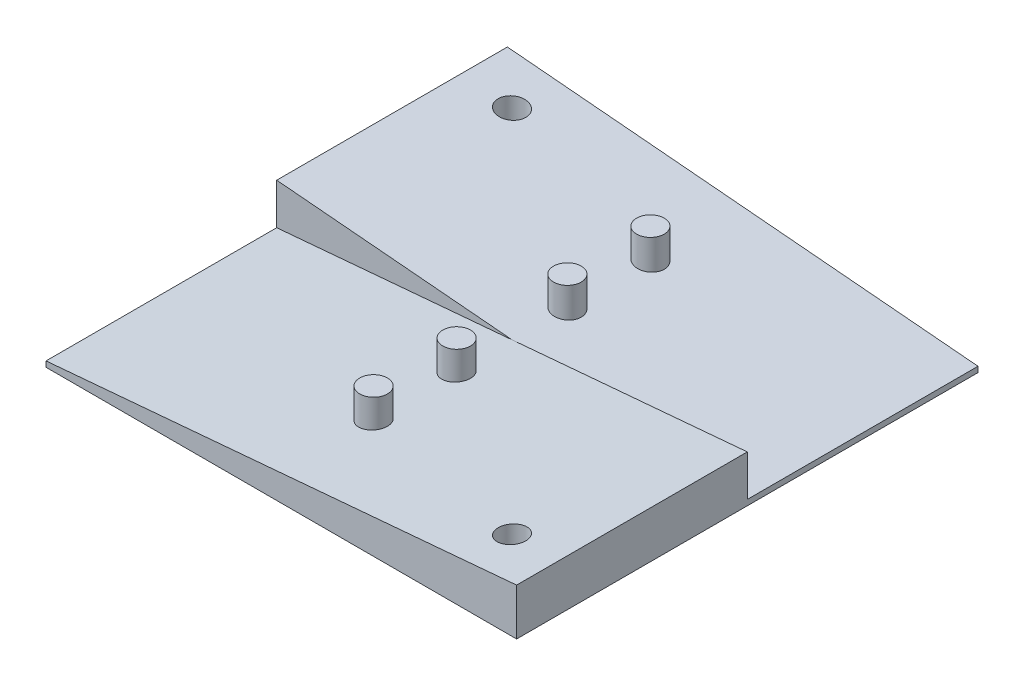
ISO-10303-21;
HEADER;
FILE_DESCRIPTION(('STEP AP214'),'2;1');
FILE_NAME('part.step','',(''),(''),'','','');
FILE_SCHEMA(('AUTOMOTIVE_DESIGN { 1 0 10303 214 1 1 1 1 }'));
ENDSEC;
DATA;
#1=APPLICATION_CONTEXT('core data for automotive mechanical design processes');
#2=APPLICATION_PROTOCOL_DEFINITION('international standard','automotive_design',2000,#1);
#3=PRODUCT_CONTEXT('',#1,'mechanical');
#4=PRODUCT('Part','Part','',(#3));
#5=PRODUCT_RELATED_PRODUCT_CATEGORY('part','',(#4));
#6=PRODUCT_DEFINITION_FORMATION('','',#4);
#7=PRODUCT_DEFINITION_CONTEXT('part definition',#1,'design');
#8=PRODUCT_DEFINITION('design','',#6,#7);
#9=PRODUCT_DEFINITION_SHAPE('','',#8);
#10=(LENGTH_UNIT() NAMED_UNIT(*) SI_UNIT(.MILLI.,.METRE.));
#11=(NAMED_UNIT(*) PLANE_ANGLE_UNIT() SI_UNIT($,.RADIAN.));
#12=(NAMED_UNIT(*) SI_UNIT($,.STERADIAN.) SOLID_ANGLE_UNIT());
#13=UNCERTAINTY_MEASURE_WITH_UNIT(LENGTH_MEASURE(1.E-05),#10,'distance_accuracy_value','');
#14=(GEOMETRIC_REPRESENTATION_CONTEXT(3) GLOBAL_UNCERTAINTY_ASSIGNED_CONTEXT((#13)) GLOBAL_UNIT_ASSIGNED_CONTEXT((#10,
#11,#12)) REPRESENTATION_CONTEXT('',''));
#15=CARTESIAN_POINT('',(0.,0.,0.));
#16=DIRECTION('',(0.,0.,1.));
#17=DIRECTION('',(1.,0.,0.));
#18=AXIS2_PLACEMENT_3D('',#15,#16,#17);
#19=CARTESIAN_POINT('',(-25.5,6.,-25.));
#20=DIRECTION('',(1.,0.,0.));
#21=DIRECTION('',(0.,0.,-1.));
#22=AXIS2_PLACEMENT_3D('',#19,#20,#21);
#23=PLANE('',#22);
#24=DIRECTION('',(0.,-1.,0.));
#25=VECTOR('',#24,1.);
#26=CARTESIAN_POINT('',(-25.5,0.6,0.));
#27=LINE('',#26,#25);
#28=CARTESIAN_POINT('',(-25.5,5.06192183982213,0.));
#29=VERTEX_POINT('',#28);
#30=CARTESIAN_POINT('',(-25.5,0.6,0.));
#31=VERTEX_POINT('',#30);
#32=EDGE_CURVE('E125',#29,#31,#27,.T.);
#33=ORIENTED_EDGE('',*,*,#32,.F.);
#34=DIRECTION('',(0.,0.,-1.));
#35=VECTOR('',#34,1.);
#36=CARTESIAN_POINT('',(-25.5,5.06192183982213,0.));
#37=LINE('',#36,#35);
#38=CARTESIAN_POINT('',(-25.5,5.06192183982213,-25.));
#39=VERTEX_POINT('',#38);
#40=EDGE_CURVE('E57',#29,#39,#37,.T.);
#41=ORIENTED_EDGE('',*,*,#40,.T.);
#42=DIRECTION('',(0.,-1.,0.));
#43=VECTOR('',#42,1.);
#44=CARTESIAN_POINT('',(-25.5,6.,-25.));
#45=LINE('',#44,#43);
#46=CARTESIAN_POINT('',(-25.5,0.,-25.));
#47=VERTEX_POINT('',#46);
#48=EDGE_CURVE('E64',#39,#47,#45,.T.);
#49=ORIENTED_EDGE('',*,*,#48,.T.);
#50=DIRECTION('',(0.,0.,1.));
#51=VECTOR('',#50,1.);
#52=CARTESIAN_POINT('',(-25.5,0.,-25.));
#53=LINE('',#52,#51);
#54=CARTESIAN_POINT('',(-25.5,0.,25.));
#55=VERTEX_POINT('',#54);
#56=EDGE_CURVE('E134',#47,#55,#53,.T.);
#57=ORIENTED_EDGE('',*,*,#56,.T.);
#58=DIRECTION('',(0.,-1.,0.));
#59=VECTOR('',#58,1.);
#60=CARTESIAN_POINT('',(-25.5,6.,25.));
#61=LINE('',#60,#59);
#62=CARTESIAN_POINT('',(-25.5,0.6,25.));
#63=VERTEX_POINT('',#62);
#64=EDGE_CURVE('E148',#63,#55,#61,.T.);
#65=ORIENTED_EDGE('',*,*,#64,.F.);
#66=DIRECTION('',(0.,0.,1.));
#67=VECTOR('',#66,1.);
#68=CARTESIAN_POINT('',(-25.5,0.6,0.));
#69=LINE('',#68,#67);
#70=EDGE_CURVE('E130',#31,#63,#69,.T.);
#71=ORIENTED_EDGE('',*,*,#70,.F.);
#72=EDGE_LOOP('',(#33,#41,#49,#57,#65,#71));
#73=FACE_BOUND('',#72,.T.);
#74=ADVANCED_FACE('F41',(#73),#23,.F.);
#75=CARTESIAN_POINT('',(25.5,6.,25.));
#76=DIRECTION('',(0.,0.,-1.));
#77=DIRECTION('',(-1.,0.,0.));
#78=AXIS2_PLACEMENT_3D('',#75,#76,#77);
#79=PLANE('',#78);
#80=DIRECTION('',(0.,-1.,0.));
#81=VECTOR('',#80,1.);
#82=CARTESIAN_POINT('',(25.5,6.,25.));
#83=LINE('',#82,#81);
#84=CARTESIAN_POINT('',(25.5,5.06192183982213,25.));
#85=VERTEX_POINT('',#84);
#86=CARTESIAN_POINT('',(25.5,0.,25.));
#87=VERTEX_POINT('',#86);
#88=EDGE_CURVE('E146',#85,#87,#83,.T.);
#89=ORIENTED_EDGE('',*,*,#88,.F.);
#90=DIRECTION('',(0.996194698091746,0.0871557427476583,0.));
#91=VECTOR('',#90,1.);
#92=CARTESIAN_POINT('',(-25.5,0.6,25.));
#93=LINE('',#92,#91);
#94=EDGE_CURVE('E121',#63,#85,#93,.T.);
#95=ORIENTED_EDGE('',*,*,#94,.F.);
#96=ORIENTED_EDGE('',*,*,#64,.T.);
#97=DIRECTION('',(1.,0.,0.));
#98=VECTOR('',#97,1.);
#99=CARTESIAN_POINT('',(25.5,0.,25.));
#100=LINE('',#99,#98);
#101=EDGE_CURVE('E137',#55,#87,#100,.T.);
#102=ORIENTED_EDGE('',*,*,#101,.T.);
#103=EDGE_LOOP('',(#89,#95,#96,#102));
#104=FACE_BOUND('',#103,.T.);
#105=ADVANCED_FACE('F224',(#104),#79,.F.);
#106=CARTESIAN_POINT('',(25.5,6.,-25.));
#107=DIRECTION('',(-1.,0.,0.));
#108=DIRECTION('',(0.,0.,1.));
#109=AXIS2_PLACEMENT_3D('',#106,#107,#108);
#110=PLANE('',#109);
#111=DIRECTION('',(0.,-1.,0.));
#112=VECTOR('',#111,1.);
#113=CARTESIAN_POINT('',(25.5,6.,-25.));
#114=LINE('',#113,#112);
#115=CARTESIAN_POINT('',(25.5,0.6,-25.));
#116=VERTEX_POINT('',#115);
#117=CARTESIAN_POINT('',(25.5,0.,-25.));
#118=VERTEX_POINT('',#117);
#119=EDGE_CURVE('E119',#116,#118,#114,.T.);
#120=ORIENTED_EDGE('',*,*,#119,.F.);
#121=DIRECTION('',(0.,0.,-1.));
#122=VECTOR('',#121,1.);
#123=CARTESIAN_POINT('',(25.5,0.6,0.));
#124=LINE('',#123,#122);
#125=CARTESIAN_POINT('',(25.5,0.6,0.));
#126=VERTEX_POINT('',#125);
#127=EDGE_CURVE('E112',#126,#116,#124,.T.);
#128=ORIENTED_EDGE('',*,*,#127,.F.);
#129=DIRECTION('',(0.,-1.,0.));
#130=VECTOR('',#129,1.);
#131=CARTESIAN_POINT('',(25.5,0.6,0.));
#132=LINE('',#131,#130);
#133=CARTESIAN_POINT('',(25.5,5.06192183982213,0.));
#134=VERTEX_POINT('',#133);
#135=EDGE_CURVE('E99',#134,#126,#132,.T.);
#136=ORIENTED_EDGE('',*,*,#135,.F.);
#137=DIRECTION('',(0.,0.,1.));
#138=VECTOR('',#137,1.);
#139=CARTESIAN_POINT('',(25.5,5.06192183982213,0.));
#140=LINE('',#139,#138);
#141=EDGE_CURVE('E132',#134,#85,#140,.T.);
#142=ORIENTED_EDGE('',*,*,#141,.T.);
#143=ORIENTED_EDGE('',*,*,#88,.T.);
#144=DIRECTION('',(0.,0.,-1.));
#145=VECTOR('',#144,1.);
#146=CARTESIAN_POINT('',(25.5,0.,-25.));
#147=LINE('',#146,#145);
#148=EDGE_CURVE('E140',#87,#118,#147,.T.);
#149=ORIENTED_EDGE('',*,*,#148,.T.);
#150=EDGE_LOOP('',(#120,#128,#136,#142,#143,#149));
#151=FACE_BOUND('',#150,.T.);
#152=ADVANCED_FACE('F117',(#151),#110,.F.);
#153=CARTESIAN_POINT('',(25.5,6.,-25.));
#154=DIRECTION('',(0.,0.,1.));
#155=DIRECTION('',(1.,0.,0.));
#156=AXIS2_PLACEMENT_3D('',#153,#154,#155);
#157=PLANE('',#156);
#158=ORIENTED_EDGE('',*,*,#48,.F.);
#159=DIRECTION('',(-0.996194698091746,0.0871557427476583,0.));
#160=VECTOR('',#159,1.);
#161=CARTESIAN_POINT('',(25.5,0.6,-25.));
#162=LINE('',#161,#160);
#163=EDGE_CURVE('E109',#116,#39,#162,.T.);
#164=ORIENTED_EDGE('',*,*,#163,.F.);
#165=ORIENTED_EDGE('',*,*,#119,.T.);
#166=DIRECTION('',(-1.,0.,0.));
#167=VECTOR('',#166,1.);
#168=CARTESIAN_POINT('',(25.5,0.,-25.));
#169=LINE('',#168,#167);
#170=EDGE_CURVE('E142',#118,#47,#169,.T.);
#171=ORIENTED_EDGE('',*,*,#170,.T.);
#172=EDGE_LOOP('',(#158,#164,#165,#171));
#173=FACE_BOUND('',#172,.T.);
#174=ADVANCED_FACE('F240',(#173),#157,.F.);
#175=CARTESIAN_POINT('',(0.,0.,0.));
#176=DIRECTION('',(0.,-1.,0.));
#177=DIRECTION('',(0.,0.,-1.));
#178=AXIS2_PLACEMENT_3D('',#175,#176,#177);
#179=PLANE('',#178);
#180=CARTESIAN_POINT('',(-20.,0.,-20.));
#181=DIRECTION('',(0.,-1.,0.));
#182=DIRECTION('',(0.,0.,-1.));
#183=AXIS2_PLACEMENT_3D('',#180,#181,#182);
#184=CIRCLE('',#183,3.00000000000002);
#185=CARTESIAN_POINT('',(-20.,0.,-23.));
#186=VERTEX_POINT('',#185);
#187=EDGE_CURVE('E50',#186,#186,#184,.F.);
#188=ORIENTED_EDGE('',*,*,#187,.T.);
#189=EDGE_LOOP('',(#188));
#190=FACE_BOUND('',#189,.T.);
#191=CARTESIAN_POINT('',(20.,0.,20.));
#192=DIRECTION('',(0.,-1.,0.));
#193=DIRECTION('',(0.,0.,-1.));
#194=AXIS2_PLACEMENT_3D('',#191,#192,#193);
#195=CIRCLE('',#194,3.00000000000002);
#196=CARTESIAN_POINT('',(20.,0.,17.));
#197=VERTEX_POINT('',#196);
#198=EDGE_CURVE('E176',#197,#197,#195,.F.);
#199=ORIENTED_EDGE('',*,*,#198,.T.);
#200=EDGE_LOOP('',(#199));
#201=FACE_BOUND('',#200,.T.);
#202=ORIENTED_EDGE('',*,*,#56,.F.);
#203=ORIENTED_EDGE('',*,*,#170,.F.);
#204=ORIENTED_EDGE('',*,*,#148,.F.);
#205=ORIENTED_EDGE('',*,*,#101,.F.);
#206=EDGE_LOOP('',(#202,#203,#204,#205));
#207=FACE_BOUND('',#206,.T.);
#208=ADVANCED_FACE('F181',(#190,#201,#207),#179,.T.);
#209=CARTESIAN_POINT('',(-25.5,0.6,0.));
#210=DIRECTION('',(0.0871557427476583,-0.996194698091746,0.));
#211=DIRECTION('',(0.996194698091746,0.0871557427476583,0.));
#212=AXIS2_PLACEMENT_3D('',#209,#210,#211);
#213=PLANE('',#212);
#214=CARTESIAN_POINT('',(20.,4.58073419042955,20.));
#215=DIRECTION('',(0.0871557427476583,-0.996194698091746,0.));
#216=DIRECTION('',(-0.996194698091746,-0.0871557427476583,0.));
#217=AXIS2_PLACEMENT_3D('',#214,#215,#216);
#218=ELLIPSE('',#217,1.50572975631502,1.5);
#219=CARTESIAN_POINT('',(18.5,4.44950119514066,20.));
#220=VERTEX_POINT('',#219);
#221=EDGE_CURVE('E171',#220,#220,#218,.T.);
#222=ORIENTED_EDGE('',*,*,#221,.T.);
#223=EDGE_LOOP('',(#222));
#224=FACE_BOUND('',#223,.T.);
#225=CARTESIAN_POINT('',(0.,2.83096091991106,15.));
#226=DIRECTION('',(0.0871557427476583,-0.996194698091746,0.));
#227=DIRECTION('',(-0.996194698091746,-0.0871557427476583,0.));
#228=AXIS2_PLACEMENT_3D('',#225,#226,#227);
#229=ELLIPSE('',#228,1.50572975631502,1.5);
#230=CARTESIAN_POINT('',(-1.5,2.69972792462218,15.));
#231=VERTEX_POINT('',#230);
#232=EDGE_CURVE('E156',#231,#231,#229,.T.);
#233=ORIENTED_EDGE('',*,*,#232,.T.);
#234=EDGE_LOOP('',(#233));
#235=FACE_BOUND('',#234,.T.);
#236=CARTESIAN_POINT('',(0.,2.83096091991106,6.));
#237=DIRECTION('',(0.0871557427476583,-0.996194698091746,0.));
#238=DIRECTION('',(-0.996194698091746,-0.0871557427476583,0.));
#239=AXIS2_PLACEMENT_3D('',#236,#237,#238);
#240=ELLIPSE('',#239,1.50572975631502,1.5);
#241=CARTESIAN_POINT('',(-1.5,2.69972792462218,6.));
#242=VERTEX_POINT('',#241);
#243=EDGE_CURVE('E152',#242,#242,#240,.T.);
#244=ORIENTED_EDGE('',*,*,#243,.T.);
#245=EDGE_LOOP('',(#244));
#246=FACE_BOUND('',#245,.T.);
#247=ORIENTED_EDGE('',*,*,#94,.T.);
#248=ORIENTED_EDGE('',*,*,#141,.F.);
#249=DIRECTION('',(0.996194698091746,0.0871557427476583,0.));
#250=VECTOR('',#249,1.);
#251=CARTESIAN_POINT('',(-25.5,0.6,0.));
#252=LINE('',#251,#250);
#253=CARTESIAN_POINT('',(-3.01841884819964E-13,2.83096091991109,0.));
#254=VERTEX_POINT('',#253);
#255=EDGE_CURVE('E104',#254,#134,#252,.T.);
#256=ORIENTED_EDGE('',*,*,#255,.F.);
#257=EDGE_CURVE('E127',#31,#254,#252,.T.);
#258=ORIENTED_EDGE('',*,*,#257,.F.);
#259=ORIENTED_EDGE('',*,*,#70,.T.);
#260=EDGE_LOOP('',(#247,#248,#256,#258,#259));
#261=FACE_BOUND('',#260,.T.);
#262=ADVANCED_FACE('F246',(#224,#235,#246,#261),#213,.F.);
#263=CARTESIAN_POINT('',(0.,0.,0.));
#264=DIRECTION('',(0.,0.,-1.));
#265=DIRECTION('',(-1.,0.,0.));
#266=AXIS2_PLACEMENT_3D('',#263,#264,#265);
#267=PLANE('',#266);
#268=ORIENTED_EDGE('',*,*,#257,.T.);
#269=DIRECTION('',(-0.996194698091746,0.0871557427476583,0.));
#270=VECTOR('',#269,1.);
#271=CARTESIAN_POINT('',(0.245795602394427,2.80945659115703,0.));
#272=LINE('',#271,#270);
#273=EDGE_CURVE('E114',#254,#29,#272,.T.);
#274=ORIENTED_EDGE('',*,*,#273,.T.);
#275=ORIENTED_EDGE('',*,*,#32,.T.);
#276=EDGE_LOOP('',(#268,#274,#275));
#277=FACE_BOUND('',#276,.T.);
#278=ADVANCED_FACE('F249',(#277),#267,.F.);
#279=CARTESIAN_POINT('',(0.,0.,0.));
#280=DIRECTION('',(0.,0.,1.));
#281=DIRECTION('',(1.,0.,0.));
#282=AXIS2_PLACEMENT_3D('',#279,#280,#281);
#283=PLANE('',#282);
#284=ORIENTED_EDGE('',*,*,#135,.T.);
#285=DIRECTION('',(-0.996194698091746,0.0871557427476583,0.));
#286=VECTOR('',#285,1.);
#287=CARTESIAN_POINT('',(25.5,0.6,0.));
#288=LINE('',#287,#286);
#289=EDGE_CURVE('E102',#126,#254,#288,.T.);
#290=ORIENTED_EDGE('',*,*,#289,.T.);
#291=ORIENTED_EDGE('',*,*,#255,.T.);
#292=EDGE_LOOP('',(#284,#290,#291));
#293=FACE_BOUND('',#292,.T.);
#294=ADVANCED_FACE('F101',(#293),#283,.F.);
#295=CARTESIAN_POINT('',(25.5,0.6,0.));
#296=DIRECTION('',(-0.0871557427476583,-0.996194698091746,0.));
#297=DIRECTION('',(0.996194698091746,-0.0871557427476583,0.));
#298=AXIS2_PLACEMENT_3D('',#295,#296,#297);
#299=PLANE('',#298);
#300=CARTESIAN_POINT('',(-20.,4.58073419042955,-20.));
#301=DIRECTION('',(-0.0871557427476583,-0.996194698091746,0.));
#302=DIRECTION('',(0.996194698091746,-0.0871557427476583,0.));
#303=AXIS2_PLACEMENT_3D('',#300,#301,#302);
#304=ELLIPSE('',#303,1.50572975631502,1.5);
#305=CARTESIAN_POINT('',(-18.5,4.44950119514066,-20.));
#306=VERTEX_POINT('',#305);
#307=EDGE_CURVE('E168',#306,#306,#304,.T.);
#308=ORIENTED_EDGE('',*,*,#307,.T.);
#309=EDGE_LOOP('',(#308));
#310=FACE_BOUND('',#309,.T.);
#311=CARTESIAN_POINT('',(0.,2.83096091991107,-6.));
#312=DIRECTION('',(-0.0871557427476583,-0.996194698091746,0.));
#313=DIRECTION('',(0.996194698091746,-0.0871557427476583,0.));
#314=AXIS2_PLACEMENT_3D('',#311,#312,#313);
#315=ELLIPSE('',#314,1.50572975631502,1.5);
#316=CARTESIAN_POINT('',(1.50000000000001,2.69972792462218,-6.));
#317=VERTEX_POINT('',#316);
#318=EDGE_CURVE('E164',#317,#317,#315,.T.);
#319=ORIENTED_EDGE('',*,*,#318,.T.);
#320=EDGE_LOOP('',(#319));
#321=FACE_BOUND('',#320,.T.);
#322=CARTESIAN_POINT('',(0.,2.83096091991107,-15.));
#323=DIRECTION('',(-0.0871557427476583,-0.996194698091746,0.));
#324=DIRECTION('',(0.996194698091746,-0.0871557427476583,0.));
#325=AXIS2_PLACEMENT_3D('',#322,#323,#324);
#326=ELLIPSE('',#325,1.50572975631502,1.5);
#327=CARTESIAN_POINT('',(1.5,2.69972792462218,-15.));
#328=VERTEX_POINT('',#327);
#329=EDGE_CURVE('E160',#328,#328,#326,.T.);
#330=ORIENTED_EDGE('',*,*,#329,.T.);
#331=EDGE_LOOP('',(#330));
#332=FACE_BOUND('',#331,.T.);
#333=ORIENTED_EDGE('',*,*,#163,.T.);
#334=ORIENTED_EDGE('',*,*,#40,.F.);
#335=ORIENTED_EDGE('',*,*,#273,.F.);
#336=ORIENTED_EDGE('',*,*,#289,.F.);
#337=ORIENTED_EDGE('',*,*,#127,.T.);
#338=EDGE_LOOP('',(#333,#334,#335,#336,#337));
#339=FACE_BOUND('',#338,.T.);
#340=ADVANCED_FACE('F111',(#310,#321,#332,#339),#299,.F.);
#341=CARTESIAN_POINT('',(0.,6.,6.));
#342=DIRECTION('',(0.,-1.,0.));
#343=DIRECTION('',(0.,0.,-1.));
#344=AXIS2_PLACEMENT_3D('',#341,#342,#343);
#345=CYLINDRICAL_SURFACE('',#344,1.5);
#346=CARTESIAN_POINT('',(0.,6.,6.));
#347=DIRECTION('',(0.,-1.,0.));
#348=DIRECTION('',(0.,0.,-1.));
#349=AXIS2_PLACEMENT_3D('',#346,#347,#348);
#350=CIRCLE('',#349,1.5);
#351=CARTESIAN_POINT('',(0.,6.,4.5));
#352=VERTEX_POINT('',#351);
#353=EDGE_CURVE('E155',#352,#352,#350,.T.);
#354=ORIENTED_EDGE('',*,*,#353,.T.);
#355=EDGE_LOOP('',(#354));
#356=FACE_BOUND('',#355,.T.);
#357=ORIENTED_EDGE('',*,*,#243,.F.);
#358=EDGE_LOOP('',(#357));
#359=FACE_BOUND('',#358,.T.);
#360=ADVANCED_FACE('F199',(#356,#359),#345,.T.);
#361=CARTESIAN_POINT('',(0.,6.,6.));
#362=DIRECTION('',(0.,-1.,0.));
#363=DIRECTION('',(0.,0.,-1.));
#364=AXIS2_PLACEMENT_3D('',#361,#362,#363);
#365=PLANE('',#364);
#366=ORIENTED_EDGE('',*,*,#353,.F.);
#367=EDGE_LOOP('',(#366));
#368=FACE_BOUND('',#367,.T.);
#369=ADVANCED_FACE('F258',(#368),#365,.F.);
#370=CARTESIAN_POINT('',(0.,6.,15.));
#371=DIRECTION('',(0.,-1.,0.));
#372=DIRECTION('',(0.,0.,-1.));
#373=AXIS2_PLACEMENT_3D('',#370,#371,#372);
#374=CYLINDRICAL_SURFACE('',#373,1.5);
#375=CARTESIAN_POINT('',(0.,6.,15.));
#376=DIRECTION('',(0.,-1.,0.));
#377=DIRECTION('',(0.,0.,-1.));
#378=AXIS2_PLACEMENT_3D('',#375,#376,#377);
#379=CIRCLE('',#378,1.5);
#380=CARTESIAN_POINT('',(0.,6.,13.5));
#381=VERTEX_POINT('',#380);
#382=EDGE_CURVE('E159',#381,#381,#379,.T.);
#383=ORIENTED_EDGE('',*,*,#382,.T.);
#384=EDGE_LOOP('',(#383));
#385=FACE_BOUND('',#384,.T.);
#386=ORIENTED_EDGE('',*,*,#232,.F.);
#387=EDGE_LOOP('',(#386));
#388=FACE_BOUND('',#387,.T.);
#389=ADVANCED_FACE('F218',(#385,#388),#374,.T.);
#390=CARTESIAN_POINT('',(0.,6.,15.));
#391=DIRECTION('',(0.,-1.,0.));
#392=DIRECTION('',(0.,0.,-1.));
#393=AXIS2_PLACEMENT_3D('',#390,#391,#392);
#394=PLANE('',#393);
#395=ORIENTED_EDGE('',*,*,#382,.F.);
#396=EDGE_LOOP('',(#395));
#397=FACE_BOUND('',#396,.T.);
#398=ADVANCED_FACE('F208',(#397),#394,.F.);
#399=CARTESIAN_POINT('',(0.,6.,-15.));
#400=DIRECTION('',(0.,-1.,0.));
#401=DIRECTION('',(0.,0.,-1.));
#402=AXIS2_PLACEMENT_3D('',#399,#400,#401);
#403=CYLINDRICAL_SURFACE('',#402,1.5);
#404=CARTESIAN_POINT('',(0.,6.,-15.));
#405=DIRECTION('',(0.,-1.,0.));
#406=DIRECTION('',(0.,0.,-1.));
#407=AXIS2_PLACEMENT_3D('',#404,#405,#406);
#408=CIRCLE('',#407,1.5);
#409=CARTESIAN_POINT('',(0.,6.,-16.5));
#410=VERTEX_POINT('',#409);
#411=EDGE_CURVE('E163',#410,#410,#408,.T.);
#412=ORIENTED_EDGE('',*,*,#411,.T.);
#413=EDGE_LOOP('',(#412));
#414=FACE_BOUND('',#413,.T.);
#415=ORIENTED_EDGE('',*,*,#329,.F.);
#416=EDGE_LOOP('',(#415));
#417=FACE_BOUND('',#416,.T.);
#418=ADVANCED_FACE('F205',(#414,#417),#403,.T.);
#419=CARTESIAN_POINT('',(0.,6.,-15.));
#420=DIRECTION('',(0.,-1.,0.));
#421=DIRECTION('',(0.,0.,-1.));
#422=AXIS2_PLACEMENT_3D('',#419,#420,#421);
#423=PLANE('',#422);
#424=ORIENTED_EDGE('',*,*,#411,.F.);
#425=EDGE_LOOP('',(#424));
#426=FACE_BOUND('',#425,.T.);
#427=ADVANCED_FACE('F207',(#426),#423,.F.);
#428=CARTESIAN_POINT('',(0.,6.,-6.));
#429=DIRECTION('',(0.,-1.,0.));
#430=DIRECTION('',(0.,0.,-1.));
#431=AXIS2_PLACEMENT_3D('',#428,#429,#430);
#432=CYLINDRICAL_SURFACE('',#431,1.5);
#433=CARTESIAN_POINT('',(0.,6.,-6.));
#434=DIRECTION('',(0.,-1.,0.));
#435=DIRECTION('',(0.,0.,-1.));
#436=AXIS2_PLACEMENT_3D('',#433,#434,#435);
#437=CIRCLE('',#436,1.5);
#438=CARTESIAN_POINT('',(0.,6.,-7.5));
#439=VERTEX_POINT('',#438);
#440=EDGE_CURVE('E167',#439,#439,#437,.T.);
#441=ORIENTED_EDGE('',*,*,#440,.T.);
#442=EDGE_LOOP('',(#441));
#443=FACE_BOUND('',#442,.T.);
#444=ORIENTED_EDGE('',*,*,#318,.F.);
#445=EDGE_LOOP('',(#444));
#446=FACE_BOUND('',#445,.T.);
#447=ADVANCED_FACE('F215',(#443,#446),#432,.T.);
#448=CARTESIAN_POINT('',(0.,6.,-6.));
#449=DIRECTION('',(0.,-1.,0.));
#450=DIRECTION('',(0.,0.,-1.));
#451=AXIS2_PLACEMENT_3D('',#448,#449,#450);
#452=PLANE('',#451);
#453=ORIENTED_EDGE('',*,*,#440,.F.);
#454=EDGE_LOOP('',(#453));
#455=FACE_BOUND('',#454,.T.);
#456=ADVANCED_FACE('F193',(#455),#452,.F.);
#457=CARTESIAN_POINT('',(-20.,6.,-20.));
#458=DIRECTION('',(0.,-1.,0.));
#459=DIRECTION('',(0.,0.,-1.));
#460=AXIS2_PLACEMENT_3D('',#457,#458,#459);
#461=CYLINDRICAL_SURFACE('',#460,1.5);
#462=CARTESIAN_POINT('',(-20.,1.50000000000002,-20.));
#463=DIRECTION('',(0.,-1.,0.));
#464=DIRECTION('',(0.,0.,-1.));
#465=AXIS2_PLACEMENT_3D('',#462,#463,#464);
#466=CIRCLE('',#465,1.5);
#467=CARTESIAN_POINT('',(-20.,1.50000000000002,-21.5));
#468=VERTEX_POINT('',#467);
#469=EDGE_CURVE('E151',#468,#468,#466,.T.);
#470=ORIENTED_EDGE('',*,*,#469,.T.);
#471=EDGE_LOOP('',(#470));
#472=FACE_BOUND('',#471,.T.);
#473=ORIENTED_EDGE('',*,*,#307,.F.);
#474=EDGE_LOOP('',(#473));
#475=FACE_BOUND('',#474,.T.);
#476=ADVANCED_FACE('F190',(#472,#475),#461,.F.);
#477=CARTESIAN_POINT('',(20.,6.,20.));
#478=DIRECTION('',(0.,-1.,0.));
#479=DIRECTION('',(0.,0.,-1.));
#480=AXIS2_PLACEMENT_3D('',#477,#478,#479);
#481=CYLINDRICAL_SURFACE('',#480,1.5);
#482=CARTESIAN_POINT('',(20.,1.50000000000002,20.));
#483=DIRECTION('',(0.,-1.,0.));
#484=DIRECTION('',(0.,0.,-1.));
#485=AXIS2_PLACEMENT_3D('',#482,#483,#484);
#486=CIRCLE('',#485,1.5);
#487=CARTESIAN_POINT('',(20.,1.50000000000002,18.5));
#488=VERTEX_POINT('',#487);
#489=EDGE_CURVE('E11',#488,#488,#486,.T.);
#490=ORIENTED_EDGE('',*,*,#489,.T.);
#491=EDGE_LOOP('',(#490));
#492=FACE_BOUND('',#491,.T.);
#493=ORIENTED_EDGE('',*,*,#221,.F.);
#494=EDGE_LOOP('',(#493));
#495=FACE_BOUND('',#494,.T.);
#496=ADVANCED_FACE('F187',(#492,#495),#481,.F.);
#497=CARTESIAN_POINT('',(-20.,1.50000000000002,-20.));
#498=DIRECTION('',(0.,-1.,0.));
#499=DIRECTION('',(0.,0.,-1.));
#500=AXIS2_PLACEMENT_3D('',#497,#498,#499);
#501=CONICAL_SURFACE('',#500,1.5,0.785398163397449);
#502=ORIENTED_EDGE('',*,*,#187,.F.);
#503=EDGE_LOOP('',(#502));
#504=FACE_BOUND('',#503,.T.);
#505=ORIENTED_EDGE('',*,*,#469,.F.);
#506=EDGE_LOOP('',(#505));
#507=FACE_BOUND('',#506,.T.);
#508=ADVANCED_FACE('F184',(#504,#507),#501,.F.);
#509=CARTESIAN_POINT('',(20.,1.50000000000002,20.));
#510=DIRECTION('',(0.,-1.,0.));
#511=DIRECTION('',(0.,0.,-1.));
#512=AXIS2_PLACEMENT_3D('',#509,#510,#511);
#513=CONICAL_SURFACE('',#512,1.5,0.785398163397449);
#514=ORIENTED_EDGE('',*,*,#198,.F.);
#515=EDGE_LOOP('',(#514));
#516=FACE_BOUND('',#515,.T.);
#517=ORIENTED_EDGE('',*,*,#489,.F.);
#518=EDGE_LOOP('',(#517));
#519=FACE_BOUND('',#518,.T.);
#520=ADVANCED_FACE('F44',(#516,#519),#513,.F.);
#521=CLOSED_SHELL('',(#74,#105,#152,#174,#208,#262,#278,#294,#340,#360,#369,#389,#398,#418,#427,
#447,#456,#476,#496,#508,#520));
#522=MANIFOLD_SOLID_BREP('B2',#521);
#523=ADVANCED_BREP_SHAPE_REPRESENTATION('',(#18,#522),#14);
#524=SHAPE_DEFINITION_REPRESENTATION(#9,#523);
ENDSEC;
END-ISO-10303-21;
